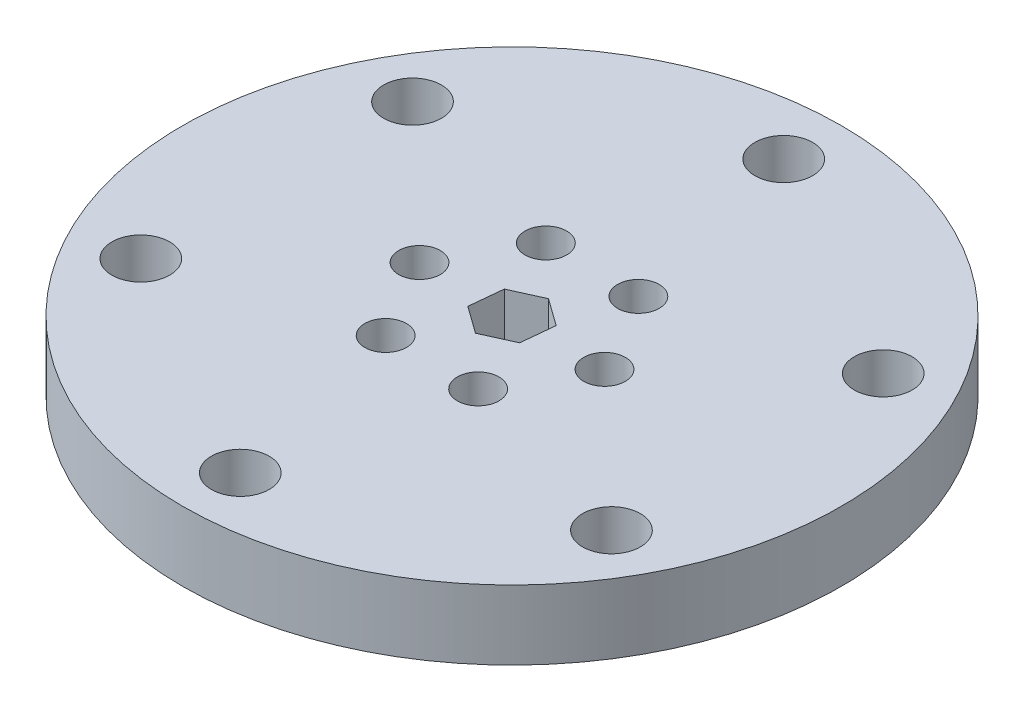
ISO-10303-21;
HEADER;
FILE_DESCRIPTION(('STEP AP214'),'2;1');
FILE_NAME('part.step','',(''),(''),'','','');
FILE_SCHEMA(('AUTOMOTIVE_DESIGN { 1 0 10303 214 1 1 1 1 }'));
ENDSEC;
DATA;
#1=APPLICATION_CONTEXT('core data for automotive mechanical design processes');
#2=APPLICATION_PROTOCOL_DEFINITION('international standard','automotive_design',2000,#1);
#3=PRODUCT_CONTEXT('',#1,'mechanical');
#4=PRODUCT('Part','Part','',(#3));
#5=PRODUCT_RELATED_PRODUCT_CATEGORY('part','',(#4));
#6=PRODUCT_DEFINITION_FORMATION('','',#4);
#7=PRODUCT_DEFINITION_CONTEXT('part definition',#1,'design');
#8=PRODUCT_DEFINITION('design','',#6,#7);
#9=PRODUCT_DEFINITION_SHAPE('','',#8);
#10=(LENGTH_UNIT() NAMED_UNIT(*) SI_UNIT(.MILLI.,.METRE.));
#11=(NAMED_UNIT(*) PLANE_ANGLE_UNIT() SI_UNIT($,.RADIAN.));
#12=(NAMED_UNIT(*) SI_UNIT($,.STERADIAN.) SOLID_ANGLE_UNIT());
#13=UNCERTAINTY_MEASURE_WITH_UNIT(LENGTH_MEASURE(1.E-05),#10,'distance_accuracy_value','');
#14=(GEOMETRIC_REPRESENTATION_CONTEXT(3) GLOBAL_UNCERTAINTY_ASSIGNED_CONTEXT((#13)) GLOBAL_UNIT_ASSIGNED_CONTEXT((#10,
#11,#12)) REPRESENTATION_CONTEXT('',''));
#15=CARTESIAN_POINT('',(0.,0.,0.));
#16=DIRECTION('',(0.,0.,1.));
#17=DIRECTION('',(1.,0.,0.));
#18=AXIS2_PLACEMENT_3D('',#15,#16,#17);
#19=CARTESIAN_POINT('',(-20.3515969889328,6.,11.7500000000009));
#20=DIRECTION('',(0.,-1.,0.));
#21=DIRECTION('',(0.,0.,-1.));
#22=AXIS2_PLACEMENT_3D('',#19,#20,#21);
#23=CYLINDRICAL_SURFACE('',#22,2.5000000000019);
#24=CARTESIAN_POINT('',(-20.3515969889328,6.,11.7500000000009));
#25=DIRECTION('',(0.,1.,0.));
#26=DIRECTION('',(0.,0.,1.));
#27=AXIS2_PLACEMENT_3D('',#24,#25,#26);
#28=CIRCLE('',#27,2.5000000000019);
#29=CARTESIAN_POINT('',(-20.3515969889328,6.,14.2500000000028));
#30=VERTEX_POINT('',#29);
#31=EDGE_CURVE('E157',#30,#30,#28,.T.);
#32=ORIENTED_EDGE('',*,*,#31,.T.);
#33=EDGE_LOOP('',(#32));
#34=FACE_BOUND('',#33,.T.);
#35=CARTESIAN_POINT('',(-20.3515969889328,0.,11.7500000000009));
#36=DIRECTION('',(0.,1.,0.));
#37=DIRECTION('',(0.,0.,1.));
#38=AXIS2_PLACEMENT_3D('',#35,#36,#37);
#39=CIRCLE('',#38,2.5000000000019);
#40=CARTESIAN_POINT('',(-20.3515969889328,0.,14.2500000000028));
#41=VERTEX_POINT('',#40);
#42=EDGE_CURVE('E178',#41,#41,#39,.T.);
#43=ORIENTED_EDGE('',*,*,#42,.F.);
#44=EDGE_LOOP('',(#43));
#45=FACE_BOUND('',#44,.T.);
#46=ADVANCED_FACE('F46',(#34,#45),#23,.F.);
#47=CARTESIAN_POINT('',(1.99797467488749E-12,6.,23.5));
#48=DIRECTION('',(0.,-1.,0.));
#49=DIRECTION('',(0.,0.,-1.));
#50=AXIS2_PLACEMENT_3D('',#47,#48,#49);
#51=CYLINDRICAL_SURFACE('',#50,2.50000000000207);
#52=CARTESIAN_POINT('',(1.99797467488749E-12,6.,23.5));
#53=DIRECTION('',(0.,1.,0.));
#54=DIRECTION('',(0.,0.,1.));
#55=AXIS2_PLACEMENT_3D('',#52,#53,#54);
#56=CIRCLE('',#55,2.50000000000207);
#57=CARTESIAN_POINT('',(1.99797467488749E-12,6.,26.0000000000021));
#58=VERTEX_POINT('',#57);
#59=EDGE_CURVE('E154',#58,#58,#56,.T.);
#60=ORIENTED_EDGE('',*,*,#59,.T.);
#61=EDGE_LOOP('',(#60));
#62=FACE_BOUND('',#61,.T.);
#63=CARTESIAN_POINT('',(1.99797467488749E-12,0.,23.5));
#64=DIRECTION('',(0.,1.,0.));
#65=DIRECTION('',(0.,0.,1.));
#66=AXIS2_PLACEMENT_3D('',#63,#64,#65);
#67=CIRCLE('',#66,2.50000000000207);
#68=CARTESIAN_POINT('',(1.99797467488749E-12,0.,26.0000000000021));
#69=VERTEX_POINT('',#68);
#70=EDGE_CURVE('E175',#69,#69,#67,.T.);
#71=ORIENTED_EDGE('',*,*,#70,.F.);
#72=EDGE_LOOP('',(#71));
#73=FACE_BOUND('',#72,.T.);
#74=ADVANCED_FACE('F279',(#62,#73),#51,.F.);
#75=CARTESIAN_POINT('',(20.3515969889358,6.,11.7499999999991));
#76=DIRECTION('',(0.,-1.,0.));
#77=DIRECTION('',(0.,0.,-1.));
#78=AXIS2_PLACEMENT_3D('',#75,#76,#77);
#79=CYLINDRICAL_SURFACE('',#78,2.50000000000129);
#80=CARTESIAN_POINT('',(20.3515969889358,6.,11.7499999999991));
#81=DIRECTION('',(0.,1.,0.));
#82=DIRECTION('',(0.,0.,1.));
#83=AXIS2_PLACEMENT_3D('',#80,#81,#82);
#84=CIRCLE('',#83,2.50000000000129);
#85=CARTESIAN_POINT('',(20.3515969889358,6.,14.2500000000004));
#86=VERTEX_POINT('',#85);
#87=EDGE_CURVE('E151',#86,#86,#84,.T.);
#88=ORIENTED_EDGE('',*,*,#87,.T.);
#89=EDGE_LOOP('',(#88));
#90=FACE_BOUND('',#89,.T.);
#91=CARTESIAN_POINT('',(20.3515969889358,0.,11.7499999999991));
#92=DIRECTION('',(0.,1.,0.));
#93=DIRECTION('',(0.,0.,1.));
#94=AXIS2_PLACEMENT_3D('',#91,#92,#93);
#95=CIRCLE('',#94,2.50000000000129);
#96=CARTESIAN_POINT('',(20.3515969889358,0.,14.2500000000004));
#97=VERTEX_POINT('',#96);
#98=EDGE_CURVE('E172',#97,#97,#95,.T.);
#99=ORIENTED_EDGE('',*,*,#98,.F.);
#100=EDGE_LOOP('',(#99));
#101=FACE_BOUND('',#100,.T.);
#102=ADVANCED_FACE('F284',(#90,#101),#79,.F.);
#103=CARTESIAN_POINT('',(20.3515969889348,6.,-11.7500000000009));
#104=DIRECTION('',(0.,-1.,0.));
#105=DIRECTION('',(0.,0.,-1.));
#106=AXIS2_PLACEMENT_3D('',#103,#104,#105);
#107=CYLINDRICAL_SURFACE('',#106,2.50000000000028);
#108=CARTESIAN_POINT('',(20.3515969889348,6.,-11.7500000000009));
#109=DIRECTION('',(0.,1.,0.));
#110=DIRECTION('',(0.,0.,1.));
#111=AXIS2_PLACEMENT_3D('',#108,#109,#110);
#112=CIRCLE('',#111,2.50000000000028);
#113=CARTESIAN_POINT('',(20.3515969889348,6.,-9.25000000000059));
#114=VERTEX_POINT('',#113);
#115=EDGE_CURVE('E148',#114,#114,#112,.T.);
#116=ORIENTED_EDGE('',*,*,#115,.T.);
#117=EDGE_LOOP('',(#116));
#118=FACE_BOUND('',#117,.T.);
#119=CARTESIAN_POINT('',(20.3515969889348,0.,-11.7500000000009));
#120=DIRECTION('',(0.,1.,0.));
#121=DIRECTION('',(0.,0.,1.));
#122=AXIS2_PLACEMENT_3D('',#119,#120,#121);
#123=CIRCLE('',#122,2.50000000000028);
#124=CARTESIAN_POINT('',(20.3515969889348,0.,-9.25000000000059));
#125=VERTEX_POINT('',#124);
#126=EDGE_CURVE('E169',#125,#125,#123,.T.);
#127=ORIENTED_EDGE('',*,*,#126,.F.);
#128=EDGE_LOOP('',(#127));
#129=FACE_BOUND('',#128,.T.);
#130=ADVANCED_FACE('F291',(#118,#129),#107,.F.);
#131=CARTESIAN_POINT('',(0.,6.,-23.5));
#132=DIRECTION('',(0.,-1.,0.));
#133=DIRECTION('',(0.,0.,-1.));
#134=AXIS2_PLACEMENT_3D('',#131,#132,#133);
#135=CYLINDRICAL_SURFACE('',#134,2.5);
#136=CARTESIAN_POINT('',(0.,6.,-23.5));
#137=DIRECTION('',(0.,1.,0.));
#138=DIRECTION('',(0.,0.,1.));
#139=AXIS2_PLACEMENT_3D('',#136,#137,#138);
#140=CIRCLE('',#139,2.5);
#141=CARTESIAN_POINT('',(0.,6.,-21.));
#142=VERTEX_POINT('',#141);
#143=EDGE_CURVE('E144',#142,#142,#140,.T.);
#144=ORIENTED_EDGE('',*,*,#143,.T.);
#145=EDGE_LOOP('',(#144));
#146=FACE_BOUND('',#145,.T.);
#147=CARTESIAN_POINT('',(0.,0.,-23.5));
#148=DIRECTION('',(0.,1.,0.));
#149=DIRECTION('',(0.,0.,1.));
#150=AXIS2_PLACEMENT_3D('',#147,#148,#149);
#151=CIRCLE('',#150,2.5);
#152=CARTESIAN_POINT('',(0.,0.,-21.));
#153=VERTEX_POINT('',#152);
#154=EDGE_CURVE('E166',#153,#153,#151,.T.);
#155=ORIENTED_EDGE('',*,*,#154,.F.);
#156=EDGE_LOOP('',(#155));
#157=FACE_BOUND('',#156,.T.);
#158=ADVANCED_FACE('F274',(#146,#157),#135,.F.);
#159=CARTESIAN_POINT('',(-20.3515969889338,6.,-11.7499999999991));
#160=DIRECTION('',(0.,-1.,0.));
#161=DIRECTION('',(0.,0.,-1.));
#162=AXIS2_PLACEMENT_3D('',#159,#160,#161);
#163=CYLINDRICAL_SURFACE('',#162,2.50000000000101);
#164=CARTESIAN_POINT('',(-20.3515969889338,6.,-11.7499999999991));
#165=DIRECTION('',(0.,1.,0.));
#166=DIRECTION('',(0.,0.,1.));
#167=AXIS2_PLACEMENT_3D('',#164,#165,#166);
#168=CIRCLE('',#167,2.50000000000101);
#169=CARTESIAN_POINT('',(-20.3515969889338,6.,-9.24999999999811));
#170=VERTEX_POINT('',#169);
#171=EDGE_CURVE('E141',#170,#170,#168,.T.);
#172=ORIENTED_EDGE('',*,*,#171,.T.);
#173=EDGE_LOOP('',(#172));
#174=FACE_BOUND('',#173,.T.);
#175=CARTESIAN_POINT('',(-20.3515969889338,0.,-11.7499999999991));
#176=DIRECTION('',(0.,1.,0.));
#177=DIRECTION('',(0.,0.,1.));
#178=AXIS2_PLACEMENT_3D('',#175,#176,#177);
#179=CIRCLE('',#178,2.50000000000101);
#180=CARTESIAN_POINT('',(-20.3515969889338,0.,-9.24999999999811));
#181=VERTEX_POINT('',#180);
#182=EDGE_CURVE('E134',#181,#181,#179,.T.);
#183=ORIENTED_EDGE('',*,*,#182,.F.);
#184=EDGE_LOOP('',(#183));
#185=FACE_BOUND('',#184,.T.);
#186=ADVANCED_FACE('F48',(#174,#185),#163,.F.);
#187=CARTESIAN_POINT('',(0.,6.,0.));
#188=DIRECTION('',(0.,-1.,0.));
#189=DIRECTION('',(0.,0.,-1.));
#190=AXIS2_PLACEMENT_3D('',#187,#188,#189);
#191=CYLINDRICAL_SURFACE('',#190,28.5);
#192=CARTESIAN_POINT('',(0.,6.,0.));
#193=DIRECTION('',(0.,1.,0.));
#194=DIRECTION('',(0.,0.,1.));
#195=AXIS2_PLACEMENT_3D('',#192,#193,#194);
#196=CIRCLE('',#195,28.5);
#197=CARTESIAN_POINT('',(0.,6.,28.5));
#198=VERTEX_POINT('',#197);
#199=EDGE_CURVE('E160',#198,#198,#196,.T.);
#200=ORIENTED_EDGE('',*,*,#199,.F.);
#201=EDGE_LOOP('',(#200));
#202=FACE_BOUND('',#201,.T.);
#203=CARTESIAN_POINT('',(0.,0.,0.));
#204=DIRECTION('',(0.,1.,0.));
#205=DIRECTION('',(0.,0.,1.));
#206=AXIS2_PLACEMENT_3D('',#203,#204,#205);
#207=CIRCLE('',#206,28.5);
#208=CARTESIAN_POINT('',(0.,0.,28.5));
#209=VERTEX_POINT('',#208);
#210=EDGE_CURVE('E145',#209,#209,#207,.T.);
#211=ORIENTED_EDGE('',*,*,#210,.T.);
#212=EDGE_LOOP('',(#211));
#213=FACE_BOUND('',#212,.T.);
#214=ADVANCED_FACE('F237',(#202,#213),#191,.T.);
#215=CARTESIAN_POINT('',(0.,6.,0.));
#216=DIRECTION('',(0.,1.,0.));
#217=DIRECTION('',(0.,0.,1.));
#218=AXIS2_PLACEMENT_3D('',#215,#216,#217);
#219=PLANE('',#218);
#220=CARTESIAN_POINT('',(4.,6.,-6.92820323027551));
#221=DIRECTION('',(0.,1.,0.));
#222=DIRECTION('',(0.,0.,1.));
#223=AXIS2_PLACEMENT_3D('',#220,#221,#222);
#224=CIRCLE('',#223,1.8);
#225=CARTESIAN_POINT('',(4.,6.,-5.12820323027552));
#226=VERTEX_POINT('',#225);
#227=EDGE_CURVE('E216',#226,#226,#224,.T.);
#228=ORIENTED_EDGE('',*,*,#227,.F.);
#229=EDGE_LOOP('',(#228));
#230=FACE_BOUND('',#229,.T.);
#231=CARTESIAN_POINT('',(8.,6.,0.));
#232=DIRECTION('',(0.,1.,0.));
#233=DIRECTION('',(0.,0.,1.));
#234=AXIS2_PLACEMENT_3D('',#231,#232,#233);
#235=CIRCLE('',#234,1.8);
#236=CARTESIAN_POINT('',(8.,6.,1.8));
#237=VERTEX_POINT('',#236);
#238=EDGE_CURVE('E219',#237,#237,#235,.T.);
#239=ORIENTED_EDGE('',*,*,#238,.F.);
#240=EDGE_LOOP('',(#239));
#241=FACE_BOUND('',#240,.T.);
#242=CARTESIAN_POINT('',(4.,6.,6.92820323027551));
#243=DIRECTION('',(0.,1.,0.));
#244=DIRECTION('',(0.,0.,1.));
#245=AXIS2_PLACEMENT_3D('',#242,#243,#244);
#246=CIRCLE('',#245,1.8);
#247=CARTESIAN_POINT('',(4.,6.,8.72820323027551));
#248=VERTEX_POINT('',#247);
#249=EDGE_CURVE('E222',#248,#248,#246,.T.);
#250=ORIENTED_EDGE('',*,*,#249,.F.);
#251=EDGE_LOOP('',(#250));
#252=FACE_BOUND('',#251,.T.);
#253=CARTESIAN_POINT('',(-4.,6.,6.92820323027551));
#254=DIRECTION('',(0.,1.,0.));
#255=DIRECTION('',(0.,0.,1.));
#256=AXIS2_PLACEMENT_3D('',#253,#254,#255);
#257=CIRCLE('',#256,1.8);
#258=CARTESIAN_POINT('',(-4.,6.,8.72820323027551));
#259=VERTEX_POINT('',#258);
#260=EDGE_CURVE('E225',#259,#259,#257,.T.);
#261=ORIENTED_EDGE('',*,*,#260,.F.);
#262=EDGE_LOOP('',(#261));
#263=FACE_BOUND('',#262,.T.);
#264=CARTESIAN_POINT('',(-8.,6.,0.));
#265=DIRECTION('',(0.,1.,0.));
#266=DIRECTION('',(0.,0.,1.));
#267=AXIS2_PLACEMENT_3D('',#264,#265,#266);
#268=CIRCLE('',#267,1.8);
#269=CARTESIAN_POINT('',(-8.,6.,1.8));
#270=VERTEX_POINT('',#269);
#271=EDGE_CURVE('E215',#270,#270,#268,.T.);
#272=ORIENTED_EDGE('',*,*,#271,.F.);
#273=EDGE_LOOP('',(#272));
#274=FACE_BOUND('',#273,.T.);
#275=CARTESIAN_POINT('',(-4.,6.,-6.92820323027551));
#276=DIRECTION('',(0.,1.,0.));
#277=DIRECTION('',(0.,0.,1.));
#278=AXIS2_PLACEMENT_3D('',#275,#276,#277);
#279=CIRCLE('',#278,1.8);
#280=CARTESIAN_POINT('',(-4.,6.,-5.12820323027551));
#281=VERTEX_POINT('',#280);
#282=EDGE_CURVE('E197',#281,#281,#279,.T.);
#283=ORIENTED_EDGE('',*,*,#282,.F.);
#284=EDGE_LOOP('',(#283));
#285=FACE_BOUND('',#284,.T.);
#286=DIRECTION('',(0.812523131831058,0.,0.582928949563709));
#287=VECTOR('',#286,1.);
#288=CARTESIAN_POINT('',(-2.63009849612292,6.,1.18992236470506));
#289=LINE('',#288,#287);
#290=CARTESIAN_POINT('',(-2.63009849612292,6.,1.18992236470506));
#291=VERTEX_POINT('',#290);
#292=CARTESIAN_POINT('',(-0.284546251695626,6.,2.87269329445023));
#293=VERTEX_POINT('',#292);
#294=EDGE_CURVE('E63',#291,#293,#289,.T.);
#295=ORIENTED_EDGE('',*,*,#294,.F.);
#296=DIRECTION('',(-0.0985697130080206,0.,0.995130148110043));
#297=VECTOR('',#296,1.);
#298=CARTESIAN_POINT('',(-2.3455522444273,6.,-1.68277092974516));
#299=LINE('',#298,#297);
#300=CARTESIAN_POINT('',(-2.3455522444273,6.,-1.68277092974516));
#301=VERTEX_POINT('',#300);
#302=EDGE_CURVE('E129',#301,#291,#299,.T.);
#303=ORIENTED_EDGE('',*,*,#302,.F.);
#304=DIRECTION('',(-0.911092844839079,0.,0.412201198546334));
#305=VECTOR('',#304,1.);
#306=CARTESIAN_POINT('',(0.284546251695625,6.,-2.87269329445023));
#307=LINE('',#306,#305);
#308=CARTESIAN_POINT('',(0.284546251695625,6.,-2.87269329445023));
#309=VERTEX_POINT('',#308);
#310=EDGE_CURVE('E123',#309,#301,#307,.T.);
#311=ORIENTED_EDGE('',*,*,#310,.F.);
#312=DIRECTION('',(-0.812523131831058,0.,-0.582928949563709));
#313=VECTOR('',#312,1.);
#314=CARTESIAN_POINT('',(2.63009849612292,6.,-1.18992236470506));
#315=LINE('',#314,#313);
#316=CARTESIAN_POINT('',(2.63009849612292,6.,-1.18992236470506));
#317=VERTEX_POINT('',#316);
#318=EDGE_CURVE('E121',#317,#309,#315,.T.);
#319=ORIENTED_EDGE('',*,*,#318,.F.);
#320=DIRECTION('',(0.0985697130080206,0.,-0.995130148110043));
#321=VECTOR('',#320,1.);
#322=CARTESIAN_POINT('',(2.34555224442729,6.,1.68277092974517));
#323=LINE('',#322,#321);
#324=CARTESIAN_POINT('',(2.34555224442729,6.,1.68277092974517));
#325=VERTEX_POINT('',#324);
#326=EDGE_CURVE('E104',#325,#317,#323,.T.);
#327=ORIENTED_EDGE('',*,*,#326,.F.);
#328=DIRECTION('',(0.911092844839079,0.,-0.412201198546334));
#329=VECTOR('',#328,1.);
#330=CARTESIAN_POINT('',(-0.284546251695626,6.,2.87269329445023));
#331=LINE('',#330,#329);
#332=EDGE_CURVE('E113',#293,#325,#331,.T.);
#333=ORIENTED_EDGE('',*,*,#332,.F.);
#334=EDGE_LOOP('',(#295,#303,#311,#319,#327,#333));
#335=FACE_BOUND('',#334,.T.);
#336=ORIENTED_EDGE('',*,*,#171,.F.);
#337=EDGE_LOOP('',(#336));
#338=FACE_BOUND('',#337,.T.);
#339=ORIENTED_EDGE('',*,*,#143,.F.);
#340=EDGE_LOOP('',(#339));
#341=FACE_BOUND('',#340,.T.);
#342=ORIENTED_EDGE('',*,*,#115,.F.);
#343=EDGE_LOOP('',(#342));
#344=FACE_BOUND('',#343,.T.);
#345=ORIENTED_EDGE('',*,*,#87,.F.);
#346=EDGE_LOOP('',(#345));
#347=FACE_BOUND('',#346,.T.);
#348=ORIENTED_EDGE('',*,*,#59,.F.);
#349=EDGE_LOOP('',(#348));
#350=FACE_BOUND('',#349,.T.);
#351=ORIENTED_EDGE('',*,*,#31,.F.);
#352=EDGE_LOOP('',(#351));
#353=FACE_BOUND('',#352,.T.);
#354=ORIENTED_EDGE('',*,*,#199,.T.);
#355=EDGE_LOOP('',(#354));
#356=FACE_BOUND('',#355,.T.);
#357=ADVANCED_FACE('F117',(#230,#241,#252,#263,#274,#285,#335,#338,#341,#344,#347,#350,#353,
#356),#219,.T.);
#358=CARTESIAN_POINT('',(0.,0.,0.));
#359=DIRECTION('',(0.,1.,0.));
#360=DIRECTION('',(0.,0.,1.));
#361=AXIS2_PLACEMENT_3D('',#358,#359,#360);
#362=PLANE('',#361);
#363=CARTESIAN_POINT('',(4.,0.,-6.92820323027551));
#364=DIRECTION('',(0.,1.,0.));
#365=DIRECTION('',(0.,0.,1.));
#366=AXIS2_PLACEMENT_3D('',#363,#364,#365);
#367=CIRCLE('',#366,1.8);
#368=CARTESIAN_POINT('',(4.,0.,-5.12820323027552));
#369=VERTEX_POINT('',#368);
#370=EDGE_CURVE('E50',#369,#369,#367,.T.);
#371=ORIENTED_EDGE('',*,*,#370,.T.);
#372=EDGE_LOOP('',(#371));
#373=FACE_BOUND('',#372,.T.);
#374=CARTESIAN_POINT('',(8.,0.,0.));
#375=DIRECTION('',(0.,1.,0.));
#376=DIRECTION('',(0.,0.,1.));
#377=AXIS2_PLACEMENT_3D('',#374,#375,#376);
#378=CIRCLE('',#377,1.8);
#379=CARTESIAN_POINT('',(8.,0.,1.8));
#380=VERTEX_POINT('',#379);
#381=EDGE_CURVE('E205',#380,#380,#378,.T.);
#382=ORIENTED_EDGE('',*,*,#381,.T.);
#383=EDGE_LOOP('',(#382));
#384=FACE_BOUND('',#383,.T.);
#385=CARTESIAN_POINT('',(4.,0.,6.92820323027551));
#386=DIRECTION('',(0.,1.,0.));
#387=DIRECTION('',(0.,0.,1.));
#388=AXIS2_PLACEMENT_3D('',#385,#386,#387);
#389=CIRCLE('',#388,1.8);
#390=CARTESIAN_POINT('',(4.,0.,8.72820323027551));
#391=VERTEX_POINT('',#390);
#392=EDGE_CURVE('E203',#391,#391,#389,.T.);
#393=ORIENTED_EDGE('',*,*,#392,.T.);
#394=EDGE_LOOP('',(#393));
#395=FACE_BOUND('',#394,.T.);
#396=CARTESIAN_POINT('',(-4.,0.,6.92820323027551));
#397=DIRECTION('',(0.,1.,0.));
#398=DIRECTION('',(0.,0.,1.));
#399=AXIS2_PLACEMENT_3D('',#396,#397,#398);
#400=CIRCLE('',#399,1.8);
#401=CARTESIAN_POINT('',(-4.,0.,8.72820323027551));
#402=VERTEX_POINT('',#401);
#403=EDGE_CURVE('E200',#402,#402,#400,.T.);
#404=ORIENTED_EDGE('',*,*,#403,.T.);
#405=EDGE_LOOP('',(#404));
#406=FACE_BOUND('',#405,.T.);
#407=CARTESIAN_POINT('',(-8.,0.,0.));
#408=DIRECTION('',(0.,1.,0.));
#409=DIRECTION('',(0.,0.,1.));
#410=AXIS2_PLACEMENT_3D('',#407,#408,#409);
#411=CIRCLE('',#410,1.8);
#412=CARTESIAN_POINT('',(-8.,0.,1.8));
#413=VERTEX_POINT('',#412);
#414=EDGE_CURVE('E196',#413,#413,#411,.T.);
#415=ORIENTED_EDGE('',*,*,#414,.T.);
#416=EDGE_LOOP('',(#415));
#417=FACE_BOUND('',#416,.T.);
#418=CARTESIAN_POINT('',(-4.,0.,-6.92820323027551));
#419=DIRECTION('',(0.,1.,0.));
#420=DIRECTION('',(0.,0.,1.));
#421=AXIS2_PLACEMENT_3D('',#418,#419,#420);
#422=CIRCLE('',#421,1.8);
#423=CARTESIAN_POINT('',(-4.,0.,-5.12820323027551));
#424=VERTEX_POINT('',#423);
#425=EDGE_CURVE('E193',#424,#424,#422,.T.);
#426=ORIENTED_EDGE('',*,*,#425,.T.);
#427=EDGE_LOOP('',(#426));
#428=FACE_BOUND('',#427,.T.);
#429=DIRECTION('',(-0.0985697130080206,0.,0.995130148110043));
#430=VECTOR('',#429,1.);
#431=CARTESIAN_POINT('',(-2.48782537027511,0.,-0.246424282520051));
#432=LINE('',#431,#430);
#433=CARTESIAN_POINT('',(-2.3455522444273,0.,-1.68277092974516));
#434=VERTEX_POINT('',#433);
#435=CARTESIAN_POINT('',(-2.63009849612292,0.,1.18992236470506));
#436=VERTEX_POINT('',#435);
#437=EDGE_CURVE('E55',#434,#436,#432,.T.);
#438=ORIENTED_EDGE('',*,*,#437,.T.);
#439=DIRECTION('',(0.812523131831058,0.,0.582928949563709));
#440=VECTOR('',#439,1.);
#441=CARTESIAN_POINT('',(-1.45732237390927,0.,2.03130782957765));
#442=LINE('',#441,#440);
#443=CARTESIAN_POINT('',(-0.284546251695626,0.,2.87269329445023));
#444=VERTEX_POINT('',#443);
#445=EDGE_CURVE('E12',#436,#444,#442,.T.);
#446=ORIENTED_EDGE('',*,*,#445,.T.);
#447=DIRECTION('',(0.911092844839079,0.,-0.412201198546334));
#448=VECTOR('',#447,1.);
#449=CARTESIAN_POINT('',(1.03050299636584,0.,2.2777321120977));
#450=LINE('',#449,#448);
#451=CARTESIAN_POINT('',(2.34555224442729,0.,1.68277092974517));
#452=VERTEX_POINT('',#451);
#453=EDGE_CURVE('E163',#444,#452,#450,.T.);
#454=ORIENTED_EDGE('',*,*,#453,.T.);
#455=DIRECTION('',(0.0985697130080206,0.,-0.995130148110043));
#456=VECTOR('',#455,1.);
#457=CARTESIAN_POINT('',(2.48782537027511,0.,0.246424282520051));
#458=LINE('',#457,#456);
#459=CARTESIAN_POINT('',(2.63009849612292,0.,-1.18992236470506));
#460=VERTEX_POINT('',#459);
#461=EDGE_CURVE('E107',#452,#460,#458,.T.);
#462=ORIENTED_EDGE('',*,*,#461,.T.);
#463=DIRECTION('',(-0.812523131831058,0.,-0.582928949563709));
#464=VECTOR('',#463,1.);
#465=CARTESIAN_POINT('',(1.45732237390927,0.,-2.03130782957764));
#466=LINE('',#465,#464);
#467=CARTESIAN_POINT('',(0.284546251695625,0.,-2.87269329445023));
#468=VERTEX_POINT('',#467);
#469=EDGE_CURVE('E185',#460,#468,#466,.T.);
#470=ORIENTED_EDGE('',*,*,#469,.T.);
#471=DIRECTION('',(-0.911092844839079,0.,0.412201198546334));
#472=VECTOR('',#471,1.);
#473=CARTESIAN_POINT('',(-1.03050299636583,0.,-2.2777321120977));
#474=LINE('',#473,#472);
#475=EDGE_CURVE('E188',#468,#434,#474,.T.);
#476=ORIENTED_EDGE('',*,*,#475,.T.);
#477=EDGE_LOOP('',(#438,#446,#454,#462,#470,#476));
#478=FACE_BOUND('',#477,.T.);
#479=ORIENTED_EDGE('',*,*,#182,.T.);
#480=EDGE_LOOP('',(#479));
#481=FACE_BOUND('',#480,.T.);
#482=ORIENTED_EDGE('',*,*,#154,.T.);
#483=EDGE_LOOP('',(#482));
#484=FACE_BOUND('',#483,.T.);
#485=ORIENTED_EDGE('',*,*,#126,.T.);
#486=EDGE_LOOP('',(#485));
#487=FACE_BOUND('',#486,.T.);
#488=ORIENTED_EDGE('',*,*,#98,.T.);
#489=EDGE_LOOP('',(#488));
#490=FACE_BOUND('',#489,.T.);
#491=ORIENTED_EDGE('',*,*,#70,.T.);
#492=EDGE_LOOP('',(#491));
#493=FACE_BOUND('',#492,.T.);
#494=ORIENTED_EDGE('',*,*,#42,.T.);
#495=EDGE_LOOP('',(#494));
#496=FACE_BOUND('',#495,.T.);
#497=ORIENTED_EDGE('',*,*,#210,.F.);
#498=EDGE_LOOP('',(#497));
#499=FACE_BOUND('',#498,.T.);
#500=ADVANCED_FACE('F236',(#373,#384,#395,#406,#417,#428,#478,#481,#484,#487,#490,#493,#496,
#499),#362,.F.);
#501=CARTESIAN_POINT('',(-2.63009849612292,-2.,1.18992236470506));
#502=DIRECTION('',(-0.582928949563709,0.,0.812523131831058));
#503=DIRECTION('',(0.812523131831058,0.,0.582928949563709));
#504=AXIS2_PLACEMENT_3D('',#501,#502,#503);
#505=PLANE('',#504);
#506=DIRECTION('',(0.,1.,0.));
#507=VECTOR('',#506,1.);
#508=CARTESIAN_POINT('',(-2.63009849612292,-2.,1.18992236470506));
#509=LINE('',#508,#507);
#510=EDGE_CURVE('E132',#436,#291,#509,.T.);
#511=ORIENTED_EDGE('',*,*,#510,.T.);
#512=ORIENTED_EDGE('',*,*,#294,.T.);
#513=DIRECTION('',(0.,1.,0.));
#514=VECTOR('',#513,1.);
#515=CARTESIAN_POINT('',(-0.284546251695626,-2.,2.87269329445023));
#516=LINE('',#515,#514);
#517=EDGE_CURVE('E110',#444,#293,#516,.T.);
#518=ORIENTED_EDGE('',*,*,#517,.F.);
#519=ORIENTED_EDGE('',*,*,#445,.F.);
#520=EDGE_LOOP('',(#511,#512,#518,#519));
#521=FACE_BOUND('',#520,.T.);
#522=ADVANCED_FACE('F250',(#521),#505,.F.);
#523=CARTESIAN_POINT('',(-2.3455522444273,-2.,-1.68277092974516));
#524=DIRECTION('',(-0.995130148110043,0.,-0.0985697130080206));
#525=DIRECTION('',(-0.0985697130080206,0.,0.995130148110043));
#526=AXIS2_PLACEMENT_3D('',#523,#524,#525);
#527=PLANE('',#526);
#528=DIRECTION('',(0.,1.,0.));
#529=VECTOR('',#528,1.);
#530=CARTESIAN_POINT('',(-2.3455522444273,-2.,-1.68277092974516));
#531=LINE('',#530,#529);
#532=EDGE_CURVE('E135',#434,#301,#531,.T.);
#533=ORIENTED_EDGE('',*,*,#532,.T.);
#534=ORIENTED_EDGE('',*,*,#302,.T.);
#535=ORIENTED_EDGE('',*,*,#510,.F.);
#536=ORIENTED_EDGE('',*,*,#437,.F.);
#537=EDGE_LOOP('',(#533,#534,#535,#536));
#538=FACE_BOUND('',#537,.T.);
#539=ADVANCED_FACE('F334',(#538),#527,.F.);
#540=CARTESIAN_POINT('',(0.284546251695625,-2.,-2.87269329445023));
#541=DIRECTION('',(-0.412201198546334,0.,-0.911092844839079));
#542=DIRECTION('',(-0.911092844839079,0.,0.412201198546334));
#543=AXIS2_PLACEMENT_3D('',#540,#541,#542);
#544=PLANE('',#543);
#545=DIRECTION('',(0.,1.,0.));
#546=VECTOR('',#545,1.);
#547=CARTESIAN_POINT('',(0.284546251695625,-2.,-2.87269329445023));
#548=LINE('',#547,#546);
#549=EDGE_CURVE('E137',#468,#309,#548,.T.);
#550=ORIENTED_EDGE('',*,*,#549,.T.);
#551=ORIENTED_EDGE('',*,*,#310,.T.);
#552=ORIENTED_EDGE('',*,*,#532,.F.);
#553=ORIENTED_EDGE('',*,*,#475,.F.);
#554=EDGE_LOOP('',(#550,#551,#552,#553));
#555=FACE_BOUND('',#554,.T.);
#556=ADVANCED_FACE('F345',(#555),#544,.F.);
#557=CARTESIAN_POINT('',(2.63009849612292,-2.,-1.18992236470506));
#558=DIRECTION('',(0.582928949563709,0.,-0.812523131831058));
#559=DIRECTION('',(-0.812523131831058,0.,-0.582928949563709));
#560=AXIS2_PLACEMENT_3D('',#557,#558,#559);
#561=PLANE('',#560);
#562=DIRECTION('',(0.,1.,0.));
#563=VECTOR('',#562,1.);
#564=CARTESIAN_POINT('',(2.63009849612292,-2.,-1.18992236470506));
#565=LINE('',#564,#563);
#566=EDGE_CURVE('E109',#460,#317,#565,.T.);
#567=ORIENTED_EDGE('',*,*,#566,.T.);
#568=ORIENTED_EDGE('',*,*,#318,.T.);
#569=ORIENTED_EDGE('',*,*,#549,.F.);
#570=ORIENTED_EDGE('',*,*,#469,.F.);
#571=EDGE_LOOP('',(#567,#568,#569,#570));
#572=FACE_BOUND('',#571,.T.);
#573=ADVANCED_FACE('F355',(#572),#561,.F.);
#574=CARTESIAN_POINT('',(2.34555224442729,-2.,1.68277092974517));
#575=DIRECTION('',(0.995130148110043,0.,0.0985697130080206));
#576=DIRECTION('',(0.0985697130080206,0.,-0.995130148110043));
#577=AXIS2_PLACEMENT_3D('',#574,#575,#576);
#578=PLANE('',#577);
#579=DIRECTION('',(0.,1.,0.));
#580=VECTOR('',#579,1.);
#581=CARTESIAN_POINT('',(2.34555224442729,-2.,1.68277092974517));
#582=LINE('',#581,#580);
#583=EDGE_CURVE('E71',#452,#325,#582,.T.);
#584=ORIENTED_EDGE('',*,*,#583,.T.);
#585=ORIENTED_EDGE('',*,*,#326,.T.);
#586=ORIENTED_EDGE('',*,*,#566,.F.);
#587=ORIENTED_EDGE('',*,*,#461,.F.);
#588=EDGE_LOOP('',(#584,#585,#586,#587));
#589=FACE_BOUND('',#588,.T.);
#590=ADVANCED_FACE('F101',(#589),#578,.F.);
#591=CARTESIAN_POINT('',(-0.284546251695626,-2.,2.87269329445023));
#592=DIRECTION('',(0.412201198546334,0.,0.911092844839079));
#593=DIRECTION('',(0.911092844839079,0.,-0.412201198546334));
#594=AXIS2_PLACEMENT_3D('',#591,#592,#593);
#595=PLANE('',#594);
#596=ORIENTED_EDGE('',*,*,#517,.T.);
#597=ORIENTED_EDGE('',*,*,#332,.T.);
#598=ORIENTED_EDGE('',*,*,#583,.F.);
#599=ORIENTED_EDGE('',*,*,#453,.F.);
#600=EDGE_LOOP('',(#596,#597,#598,#599));
#601=FACE_BOUND('',#600,.T.);
#602=ADVANCED_FACE('F114',(#601),#595,.F.);
#603=CARTESIAN_POINT('',(-4.,-4.54,-6.92820323027551));
#604=DIRECTION('',(0.,1.,0.));
#605=DIRECTION('',(0.,0.,1.));
#606=AXIS2_PLACEMENT_3D('',#603,#604,#605);
#607=CYLINDRICAL_SURFACE('',#606,1.8);
#608=ORIENTED_EDGE('',*,*,#282,.T.);
#609=EDGE_LOOP('',(#608));
#610=FACE_BOUND('',#609,.T.);
#611=ORIENTED_EDGE('',*,*,#425,.F.);
#612=EDGE_LOOP('',(#611));
#613=FACE_BOUND('',#612,.T.);
#614=ADVANCED_FACE('F242',(#610,#613),#607,.F.);
#615=CARTESIAN_POINT('',(-8.,-4.54,0.));
#616=DIRECTION('',(0.,1.,0.));
#617=DIRECTION('',(0.,0.,1.));
#618=AXIS2_PLACEMENT_3D('',#615,#616,#617);
#619=CYLINDRICAL_SURFACE('',#618,1.8);
#620=ORIENTED_EDGE('',*,*,#271,.T.);
#621=EDGE_LOOP('',(#620));
#622=FACE_BOUND('',#621,.T.);
#623=ORIENTED_EDGE('',*,*,#414,.F.);
#624=EDGE_LOOP('',(#623));
#625=FACE_BOUND('',#624,.T.);
#626=ADVANCED_FACE('F231',(#622,#625),#619,.F.);
#627=CARTESIAN_POINT('',(-4.,-4.54,6.92820323027551));
#628=DIRECTION('',(0.,1.,0.));
#629=DIRECTION('',(0.,0.,1.));
#630=AXIS2_PLACEMENT_3D('',#627,#628,#629);
#631=CYLINDRICAL_SURFACE('',#630,1.8);
#632=ORIENTED_EDGE('',*,*,#260,.T.);
#633=EDGE_LOOP('',(#632));
#634=FACE_BOUND('',#633,.T.);
#635=ORIENTED_EDGE('',*,*,#403,.F.);
#636=EDGE_LOOP('',(#635));
#637=FACE_BOUND('',#636,.T.);
#638=ADVANCED_FACE('F401',(#634,#637),#631,.F.);
#639=CARTESIAN_POINT('',(4.,-4.54,6.92820323027551));
#640=DIRECTION('',(0.,1.,0.));
#641=DIRECTION('',(0.,0.,1.));
#642=AXIS2_PLACEMENT_3D('',#639,#640,#641);
#643=CYLINDRICAL_SURFACE('',#642,1.8);
#644=ORIENTED_EDGE('',*,*,#249,.T.);
#645=EDGE_LOOP('',(#644));
#646=FACE_BOUND('',#645,.T.);
#647=ORIENTED_EDGE('',*,*,#392,.F.);
#648=EDGE_LOOP('',(#647));
#649=FACE_BOUND('',#648,.T.);
#650=ADVANCED_FACE('F411',(#646,#649),#643,.F.);
#651=CARTESIAN_POINT('',(8.,-4.54,0.));
#652=DIRECTION('',(0.,1.,0.));
#653=DIRECTION('',(0.,0.,1.));
#654=AXIS2_PLACEMENT_3D('',#651,#652,#653);
#655=CYLINDRICAL_SURFACE('',#654,1.8);
#656=ORIENTED_EDGE('',*,*,#238,.T.);
#657=EDGE_LOOP('',(#656));
#658=FACE_BOUND('',#657,.T.);
#659=ORIENTED_EDGE('',*,*,#381,.F.);
#660=EDGE_LOOP('',(#659));
#661=FACE_BOUND('',#660,.T.);
#662=ADVANCED_FACE('F421',(#658,#661),#655,.F.);
#663=CARTESIAN_POINT('',(4.,-4.54,-6.92820323027551));
#664=DIRECTION('',(0.,1.,0.));
#665=DIRECTION('',(0.,0.,1.));
#666=AXIS2_PLACEMENT_3D('',#663,#664,#665);
#667=CYLINDRICAL_SURFACE('',#666,1.8);
#668=ORIENTED_EDGE('',*,*,#227,.T.);
#669=EDGE_LOOP('',(#668));
#670=FACE_BOUND('',#669,.T.);
#671=ORIENTED_EDGE('',*,*,#370,.F.);
#672=EDGE_LOOP('',(#671));
#673=FACE_BOUND('',#672,.T.);
#674=ADVANCED_FACE('F431',(#670,#673),#667,.F.);
#675=CLOSED_SHELL('',(#46,#74,#102,#130,#158,#186,#214,#357,#500,#522,#539,#556,#573,#590,#602,
#614,#626,#638,#650,#662,#674));
#676=MANIFOLD_SOLID_BREP('B2',#675);
#677=ADVANCED_BREP_SHAPE_REPRESENTATION('',(#18,#676),#14);
#678=SHAPE_DEFINITION_REPRESENTATION(#9,#677);
ENDSEC;
END-ISO-10303-21;
